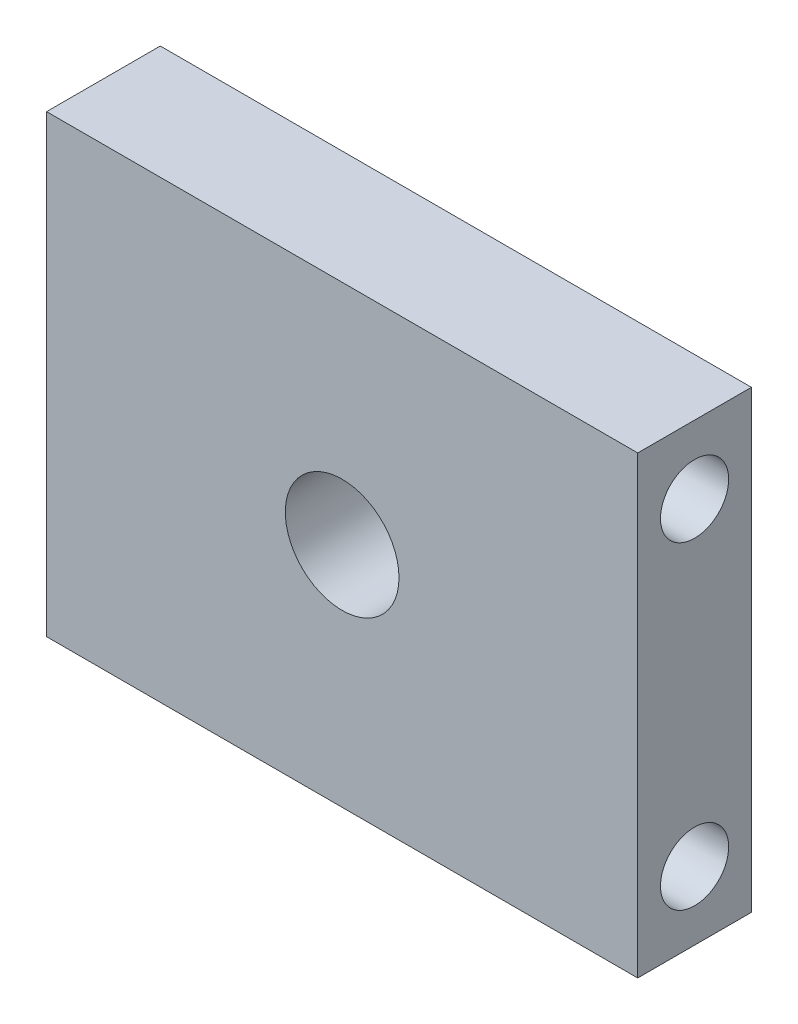
ISO-10303-21;
HEADER;
FILE_DESCRIPTION(('STEP AP214'),'2;1');
FILE_NAME('part.step','',(''),(''),'','','');
FILE_SCHEMA(('AUTOMOTIVE_DESIGN { 1 0 10303 214 1 1 1 1 }'));
ENDSEC;
DATA;
#1=APPLICATION_CONTEXT('core data for automotive mechanical design processes');
#2=APPLICATION_PROTOCOL_DEFINITION('international standard','automotive_design',2000,#1);
#3=PRODUCT_CONTEXT('',#1,'mechanical');
#4=PRODUCT('Part','Part','',(#3));
#5=PRODUCT_RELATED_PRODUCT_CATEGORY('part','',(#4));
#6=PRODUCT_DEFINITION_FORMATION('','',#4);
#7=PRODUCT_DEFINITION_CONTEXT('part definition',#1,'design');
#8=PRODUCT_DEFINITION('design','',#6,#7);
#9=PRODUCT_DEFINITION_SHAPE('','',#8);
#10=(LENGTH_UNIT() NAMED_UNIT(*) SI_UNIT(.MILLI.,.METRE.));
#11=(NAMED_UNIT(*) PLANE_ANGLE_UNIT() SI_UNIT($,.RADIAN.));
#12=(NAMED_UNIT(*) SI_UNIT($,.STERADIAN.) SOLID_ANGLE_UNIT());
#13=UNCERTAINTY_MEASURE_WITH_UNIT(LENGTH_MEASURE(1.E-05),#10,'distance_accuracy_value','');
#14=(GEOMETRIC_REPRESENTATION_CONTEXT(3) GLOBAL_UNCERTAINTY_ASSIGNED_CONTEXT((#13)) GLOBAL_UNIT_ASSIGNED_CONTEXT((#10,
#11,#12)) REPRESENTATION_CONTEXT('',''));
#15=CARTESIAN_POINT('',(0.,0.,0.));
#16=DIRECTION('',(0.,0.,1.));
#17=DIRECTION('',(1.,0.,0.));
#18=AXIS2_PLACEMENT_3D('',#15,#16,#17);
#19=CARTESIAN_POINT('',(13.,10.,5.));
#20=DIRECTION('',(-1.,0.,0.));
#21=DIRECTION('',(0.,-1.,0.));
#22=AXIS2_PLACEMENT_3D('',#19,#20,#21);
#23=PLANE('',#22);
#24=CARTESIAN_POINT('',(13.,7.,2.5));
#25=DIRECTION('',(-1.,0.,0.));
#26=DIRECTION('',(0.,-1.,0.));
#27=AXIS2_PLACEMENT_3D('',#24,#25,#26);
#28=CIRCLE('',#27,1.5);
#29=CARTESIAN_POINT('',(13.,5.5,2.5));
#30=VERTEX_POINT('',#29);
#31=EDGE_CURVE('E118',#30,#30,#28,.F.);
#32=ORIENTED_EDGE('',*,*,#31,.F.);
#33=EDGE_LOOP('',(#32));
#34=FACE_BOUND('',#33,.T.);
#35=CARTESIAN_POINT('',(13.,-7.,2.5));
#36=DIRECTION('',(-1.,0.,0.));
#37=DIRECTION('',(0.,-1.,0.));
#38=AXIS2_PLACEMENT_3D('',#35,#36,#37);
#39=CIRCLE('',#38,1.5);
#40=CARTESIAN_POINT('',(13.,-8.5,2.5));
#41=VERTEX_POINT('',#40);
#42=EDGE_CURVE('E121',#41,#41,#39,.F.);
#43=ORIENTED_EDGE('',*,*,#42,.F.);
#44=EDGE_LOOP('',(#43));
#45=FACE_BOUND('',#44,.T.);
#46=DIRECTION('',(0.,1.,0.));
#47=VECTOR('',#46,1.);
#48=CARTESIAN_POINT('',(13.,10.,0.));
#49=LINE('',#48,#47);
#50=CARTESIAN_POINT('',(13.,-10.,0.));
#51=VERTEX_POINT('',#50);
#52=CARTESIAN_POINT('',(13.,10.,0.));
#53=VERTEX_POINT('',#52);
#54=EDGE_CURVE('E101',#51,#53,#49,.T.);
#55=ORIENTED_EDGE('',*,*,#54,.T.);
#56=DIRECTION('',(0.,0.,-1.));
#57=VECTOR('',#56,1.);
#58=CARTESIAN_POINT('',(13.,10.,5.));
#59=LINE('',#58,#57);
#60=CARTESIAN_POINT('',(13.,10.,5.));
#61=VERTEX_POINT('',#60);
#62=EDGE_CURVE('E11',#61,#53,#59,.T.);
#63=ORIENTED_EDGE('',*,*,#62,.F.);
#64=DIRECTION('',(0.,1.,0.));
#65=VECTOR('',#64,1.);
#66=CARTESIAN_POINT('',(13.,10.,5.));
#67=LINE('',#66,#65);
#68=CARTESIAN_POINT('',(13.,-10.,5.));
#69=VERTEX_POINT('',#68);
#70=EDGE_CURVE('E89',#69,#61,#67,.T.);
#71=ORIENTED_EDGE('',*,*,#70,.F.);
#72=DIRECTION('',(0.,0.,-1.));
#73=VECTOR('',#72,1.);
#74=CARTESIAN_POINT('',(13.,-10.,5.));
#75=LINE('',#74,#73);
#76=EDGE_CURVE('E97',#69,#51,#75,.T.);
#77=ORIENTED_EDGE('',*,*,#76,.T.);
#78=EDGE_LOOP('',(#55,#63,#71,#77));
#79=FACE_BOUND('',#78,.T.);
#80=ADVANCED_FACE('F38',(#34,#45,#79),#23,.F.);
#81=CARTESIAN_POINT('',(-13.,10.,5.));
#82=DIRECTION('',(0.,-1.,0.));
#83=DIRECTION('',(0.,0.,-1.));
#84=AXIS2_PLACEMENT_3D('',#81,#82,#83);
#85=PLANE('',#84);
#86=DIRECTION('',(-1.,0.,0.));
#87=VECTOR('',#86,1.);
#88=CARTESIAN_POINT('',(-13.,10.,0.));
#89=LINE('',#88,#87);
#90=CARTESIAN_POINT('',(-13.,10.,0.));
#91=VERTEX_POINT('',#90);
#92=EDGE_CURVE('E93',#53,#91,#89,.T.);
#93=ORIENTED_EDGE('',*,*,#92,.T.);
#94=DIRECTION('',(0.,0.,-1.));
#95=VECTOR('',#94,1.);
#96=CARTESIAN_POINT('',(-13.,10.,5.));
#97=LINE('',#96,#95);
#98=CARTESIAN_POINT('',(-13.,10.,5.));
#99=VERTEX_POINT('',#98);
#100=EDGE_CURVE('E46',#99,#91,#97,.T.);
#101=ORIENTED_EDGE('',*,*,#100,.F.);
#102=DIRECTION('',(-1.,0.,0.));
#103=VECTOR('',#102,1.);
#104=CARTESIAN_POINT('',(-13.,10.,5.));
#105=LINE('',#104,#103);
#106=EDGE_CURVE('E84',#61,#99,#105,.T.);
#107=ORIENTED_EDGE('',*,*,#106,.F.);
#108=ORIENTED_EDGE('',*,*,#62,.T.);
#109=EDGE_LOOP('',(#93,#101,#107,#108));
#110=FACE_BOUND('',#109,.T.);
#111=ADVANCED_FACE('F92',(#110),#85,.F.);
#112=CARTESIAN_POINT('',(-13.,10.,5.));
#113=DIRECTION('',(1.,0.,0.));
#114=DIRECTION('',(0.,1.,0.));
#115=AXIS2_PLACEMENT_3D('',#112,#113,#114);
#116=PLANE('',#115);
#117=CARTESIAN_POINT('',(-13.,7.,2.5));
#118=DIRECTION('',(-1.,0.,0.));
#119=DIRECTION('',(0.,0.,1.));
#120=AXIS2_PLACEMENT_3D('',#117,#118,#119);
#121=CIRCLE('',#120,1.5);
#122=CARTESIAN_POINT('',(-13.,7.,4.));
#123=VERTEX_POINT('',#122);
#124=EDGE_CURVE('E124',#123,#123,#121,.T.);
#125=ORIENTED_EDGE('',*,*,#124,.F.);
#126=EDGE_LOOP('',(#125));
#127=FACE_BOUND('',#126,.T.);
#128=CARTESIAN_POINT('',(-13.,-7.,2.5));
#129=DIRECTION('',(-1.,0.,0.));
#130=DIRECTION('',(0.,0.,-1.));
#131=AXIS2_PLACEMENT_3D('',#128,#129,#130);
#132=CIRCLE('',#131,1.5);
#133=CARTESIAN_POINT('',(-13.,-7.,0.999999999999997));
#134=VERTEX_POINT('',#133);
#135=EDGE_CURVE('E125',#134,#134,#132,.T.);
#136=ORIENTED_EDGE('',*,*,#135,.F.);
#137=EDGE_LOOP('',(#136));
#138=FACE_BOUND('',#137,.T.);
#139=DIRECTION('',(0.,-1.,0.));
#140=VECTOR('',#139,1.);
#141=CARTESIAN_POINT('',(-13.,10.,0.));
#142=LINE('',#141,#140);
#143=CARTESIAN_POINT('',(-13.,-10.,0.));
#144=VERTEX_POINT('',#143);
#145=EDGE_CURVE('E71',#91,#144,#142,.T.);
#146=ORIENTED_EDGE('',*,*,#145,.T.);
#147=DIRECTION('',(0.,0.,-1.));
#148=VECTOR('',#147,1.);
#149=CARTESIAN_POINT('',(-13.,-10.,5.));
#150=LINE('',#149,#148);
#151=CARTESIAN_POINT('',(-13.,-10.,5.));
#152=VERTEX_POINT('',#151);
#153=EDGE_CURVE('E94',#152,#144,#150,.T.);
#154=ORIENTED_EDGE('',*,*,#153,.F.);
#155=DIRECTION('',(0.,-1.,0.));
#156=VECTOR('',#155,1.);
#157=CARTESIAN_POINT('',(-13.,10.,5.));
#158=LINE('',#157,#156);
#159=EDGE_CURVE('E87',#99,#152,#158,.T.);
#160=ORIENTED_EDGE('',*,*,#159,.F.);
#161=ORIENTED_EDGE('',*,*,#100,.T.);
#162=EDGE_LOOP('',(#146,#154,#160,#161));
#163=FACE_BOUND('',#162,.T.);
#164=ADVANCED_FACE('F95',(#127,#138,#163),#116,.F.);
#165=CARTESIAN_POINT('',(-13.,-10.,5.));
#166=DIRECTION('',(0.,1.,0.));
#167=DIRECTION('',(0.,0.,1.));
#168=AXIS2_PLACEMENT_3D('',#165,#166,#167);
#169=PLANE('',#168);
#170=DIRECTION('',(1.,0.,0.));
#171=VECTOR('',#170,1.);
#172=CARTESIAN_POINT('',(-13.,-10.,0.));
#173=LINE('',#172,#171);
#174=EDGE_CURVE('E77',#144,#51,#173,.T.);
#175=ORIENTED_EDGE('',*,*,#174,.T.);
#176=ORIENTED_EDGE('',*,*,#76,.F.);
#177=DIRECTION('',(1.,0.,0.));
#178=VECTOR('',#177,1.);
#179=CARTESIAN_POINT('',(-13.,-10.,5.));
#180=LINE('',#179,#178);
#181=EDGE_CURVE('E54',#152,#69,#180,.T.);
#182=ORIENTED_EDGE('',*,*,#181,.F.);
#183=ORIENTED_EDGE('',*,*,#153,.T.);
#184=EDGE_LOOP('',(#175,#176,#182,#183));
#185=FACE_BOUND('',#184,.T.);
#186=ADVANCED_FACE('F109',(#185),#169,.F.);
#187=CARTESIAN_POINT('',(0.,0.,5.));
#188=DIRECTION('',(0.,0.,1.));
#189=DIRECTION('',(1.,0.,0.));
#190=AXIS2_PLACEMENT_3D('',#187,#188,#189);
#191=PLANE('',#190);
#192=CARTESIAN_POINT('',(0.,0.,5.));
#193=DIRECTION('',(0.,0.,1.));
#194=DIRECTION('',(1.,0.,0.));
#195=AXIS2_PLACEMENT_3D('',#192,#193,#194);
#196=CIRCLE('',#195,2.5);
#197=CARTESIAN_POINT('',(2.5,0.,5.));
#198=VERTEX_POINT('',#197);
#199=EDGE_CURVE('E115',#198,#198,#196,.T.);
#200=ORIENTED_EDGE('',*,*,#199,.F.);
#201=EDGE_LOOP('',(#200));
#202=FACE_BOUND('',#201,.T.);
#203=ORIENTED_EDGE('',*,*,#70,.T.);
#204=ORIENTED_EDGE('',*,*,#106,.T.);
#205=ORIENTED_EDGE('',*,*,#159,.T.);
#206=ORIENTED_EDGE('',*,*,#181,.T.);
#207=EDGE_LOOP('',(#203,#204,#205,#206));
#208=FACE_BOUND('',#207,.T.);
#209=ADVANCED_FACE('F85',(#202,#208),#191,.T.);
#210=CARTESIAN_POINT('',(0.,0.,0.));
#211=DIRECTION('',(0.,0.,1.));
#212=DIRECTION('',(1.,0.,0.));
#213=AXIS2_PLACEMENT_3D('',#210,#211,#212);
#214=PLANE('',#213);
#215=CARTESIAN_POINT('',(0.,0.,0.));
#216=DIRECTION('',(0.,0.,1.));
#217=DIRECTION('',(1.,0.,0.));
#218=AXIS2_PLACEMENT_3D('',#215,#216,#217);
#219=CIRCLE('',#218,2.5);
#220=CARTESIAN_POINT('',(2.5,0.,0.));
#221=VERTEX_POINT('',#220);
#222=EDGE_CURVE('E104',#221,#221,#219,.T.);
#223=ORIENTED_EDGE('',*,*,#222,.T.);
#224=EDGE_LOOP('',(#223));
#225=FACE_BOUND('',#224,.T.);
#226=ORIENTED_EDGE('',*,*,#54,.F.);
#227=ORIENTED_EDGE('',*,*,#174,.F.);
#228=ORIENTED_EDGE('',*,*,#145,.F.);
#229=ORIENTED_EDGE('',*,*,#92,.F.);
#230=EDGE_LOOP('',(#226,#227,#228,#229));
#231=FACE_BOUND('',#230,.T.);
#232=ADVANCED_FACE('F112',(#225,#231),#214,.F.);
#233=CARTESIAN_POINT('',(0.,0.,0.));
#234=DIRECTION('',(0.,0.,1.));
#235=DIRECTION('',(1.,0.,0.));
#236=AXIS2_PLACEMENT_3D('',#233,#234,#235);
#237=CYLINDRICAL_SURFACE('',#236,2.5);
#238=ORIENTED_EDGE('',*,*,#222,.F.);
#239=EDGE_LOOP('',(#238));
#240=FACE_BOUND('',#239,.T.);
#241=ORIENTED_EDGE('',*,*,#199,.T.);
#242=EDGE_LOOP('',(#241));
#243=FACE_BOUND('',#242,.T.);
#244=ADVANCED_FACE('F144',(#240,#243),#237,.F.);
#245=CARTESIAN_POINT('',(13.001,-7.,2.5));
#246=DIRECTION('',(-1.,0.,0.));
#247=DIRECTION('',(0.,0.,1.));
#248=AXIS2_PLACEMENT_3D('',#245,#246,#247);
#249=CYLINDRICAL_SURFACE('',#248,1.5);
#250=ORIENTED_EDGE('',*,*,#135,.T.);
#251=EDGE_LOOP('',(#250));
#252=FACE_BOUND('',#251,.T.);
#253=ORIENTED_EDGE('',*,*,#42,.T.);
#254=EDGE_LOOP('',(#253));
#255=FACE_BOUND('',#254,.T.);
#256=ADVANCED_FACE('F141',(#252,#255),#249,.F.);
#257=CARTESIAN_POINT('',(13.001,7.,2.5));
#258=DIRECTION('',(-1.,0.,0.));
#259=DIRECTION('',(0.,0.,1.));
#260=AXIS2_PLACEMENT_3D('',#257,#258,#259);
#261=CYLINDRICAL_SURFACE('',#260,1.5);
#262=ORIENTED_EDGE('',*,*,#124,.T.);
#263=EDGE_LOOP('',(#262));
#264=FACE_BOUND('',#263,.T.);
#265=ORIENTED_EDGE('',*,*,#31,.T.);
#266=EDGE_LOOP('',(#265));
#267=FACE_BOUND('',#266,.T.);
#268=ADVANCED_FACE('F133',(#264,#267),#261,.F.);
#269=CLOSED_SHELL('',(#80,#111,#164,#186,#209,#232,#244,#256,#268));
#270=MANIFOLD_SOLID_BREP('B2',#269);
#271=ADVANCED_BREP_SHAPE_REPRESENTATION('',(#18,#270),#14);
#272=SHAPE_DEFINITION_REPRESENTATION(#9,#271);
ENDSEC;
END-ISO-10303-21;
